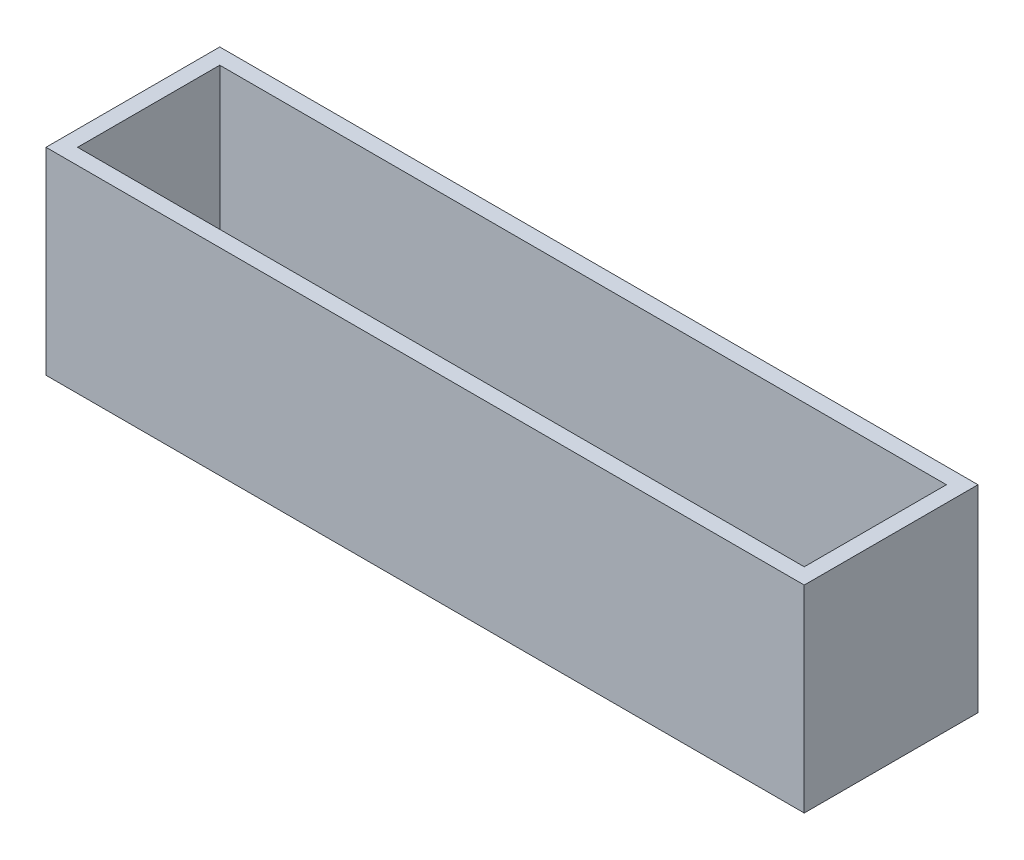
ISO-10303-21;
HEADER;
FILE_DESCRIPTION(('STEP AP214'),'2;1');
FILE_NAME('part.step','',(''),(''),'','','');
FILE_SCHEMA(('AUTOMOTIVE_DESIGN { 1 0 10303 214 1 1 1 1 }'));
ENDSEC;
DATA;
#1=APPLICATION_CONTEXT('core data for automotive mechanical design processes');
#2=APPLICATION_PROTOCOL_DEFINITION('international standard','automotive_design',2000,#1);
#3=PRODUCT_CONTEXT('',#1,'mechanical');
#4=PRODUCT('Part','Part','',(#3));
#5=PRODUCT_RELATED_PRODUCT_CATEGORY('part','',(#4));
#6=PRODUCT_DEFINITION_FORMATION('','',#4);
#7=PRODUCT_DEFINITION_CONTEXT('part definition',#1,'design');
#8=PRODUCT_DEFINITION('design','',#6,#7);
#9=PRODUCT_DEFINITION_SHAPE('','',#8);
#10=(LENGTH_UNIT() NAMED_UNIT(*) SI_UNIT(.MILLI.,.METRE.));
#11=(NAMED_UNIT(*) PLANE_ANGLE_UNIT() SI_UNIT($,.RADIAN.));
#12=(NAMED_UNIT(*) SI_UNIT($,.STERADIAN.) SOLID_ANGLE_UNIT());
#13=UNCERTAINTY_MEASURE_WITH_UNIT(LENGTH_MEASURE(1.E-05),#10,'distance_accuracy_value','');
#14=(GEOMETRIC_REPRESENTATION_CONTEXT(3) GLOBAL_UNCERTAINTY_ASSIGNED_CONTEXT((#13)) GLOBAL_UNIT_ASSIGNED_CONTEXT((#10,
#11,#12)) REPRESENTATION_CONTEXT('',''));
#15=CARTESIAN_POINT('',(0.,0.,0.));
#16=DIRECTION('',(0.,0.,1.));
#17=DIRECTION('',(1.,0.,0.));
#18=AXIS2_PLACEMENT_3D('',#15,#16,#17);
#19=CARTESIAN_POINT('',(152.4,3.175,34.925));
#20=DIRECTION('',(-1.,0.,0.));
#21=DIRECTION('',(0.,0.,1.));
#22=AXIS2_PLACEMENT_3D('',#19,#20,#21);
#23=PLANE('',#22);
#24=DIRECTION('',(0.,0.,-1.));
#25=VECTOR('',#24,1.);
#26=CARTESIAN_POINT('',(152.4,0.,34.925));
#27=LINE('',#26,#25);
#28=CARTESIAN_POINT('',(152.4,0.,34.925));
#29=VERTEX_POINT('',#28);
#30=CARTESIAN_POINT('',(152.4,0.,-34.925));
#31=VERTEX_POINT('',#30);
#32=EDGE_CURVE('E156',#29,#31,#27,.T.);
#33=ORIENTED_EDGE('',*,*,#32,.T.);
#34=DIRECTION('',(0.,-1.,0.));
#35=VECTOR('',#34,1.);
#36=CARTESIAN_POINT('',(152.4,3.175,-34.925));
#37=LINE('',#36,#35);
#38=CARTESIAN_POINT('',(152.4,79.375,-34.925));
#39=VERTEX_POINT('',#38);
#40=EDGE_CURVE('E11',#39,#31,#37,.T.);
#41=ORIENTED_EDGE('',*,*,#40,.F.);
#42=DIRECTION('',(0.,0.,-1.));
#43=VECTOR('',#42,1.);
#44=CARTESIAN_POINT('',(152.4,79.375,34.925));
#45=LINE('',#44,#43);
#46=CARTESIAN_POINT('',(152.4,79.375,34.925));
#47=VERTEX_POINT('',#46);
#48=EDGE_CURVE('E147',#47,#39,#45,.T.);
#49=ORIENTED_EDGE('',*,*,#48,.F.);
#50=DIRECTION('',(0.,-1.,0.));
#51=VECTOR('',#50,1.);
#52=CARTESIAN_POINT('',(152.4,3.175,34.925));
#53=LINE('',#52,#51);
#54=EDGE_CURVE('E164',#47,#29,#53,.T.);
#55=ORIENTED_EDGE('',*,*,#54,.T.);
#56=EDGE_LOOP('',(#33,#41,#49,#55));
#57=FACE_BOUND('',#56,.T.);
#58=ADVANCED_FACE('F39',(#57),#23,.F.);
#59=CARTESIAN_POINT('',(-152.4,3.175,-34.925));
#60=DIRECTION('',(0.,0.,1.));
#61=DIRECTION('',(1.,0.,0.));
#62=AXIS2_PLACEMENT_3D('',#59,#60,#61);
#63=PLANE('',#62);
#64=DIRECTION('',(-1.,0.,0.));
#65=VECTOR('',#64,1.);
#66=CARTESIAN_POINT('',(-152.4,0.,-34.925));
#67=LINE('',#66,#65);
#68=CARTESIAN_POINT('',(-152.4,0.,-34.925));
#69=VERTEX_POINT('',#68);
#70=EDGE_CURVE('E159',#31,#69,#67,.T.);
#71=ORIENTED_EDGE('',*,*,#70,.T.);
#72=DIRECTION('',(0.,-1.,0.));
#73=VECTOR('',#72,1.);
#74=CARTESIAN_POINT('',(-152.4,3.175,-34.925));
#75=LINE('',#74,#73);
#76=CARTESIAN_POINT('',(-152.4,79.375,-34.925));
#77=VERTEX_POINT('',#76);
#78=EDGE_CURVE('E46',#77,#69,#75,.T.);
#79=ORIENTED_EDGE('',*,*,#78,.F.);
#80=DIRECTION('',(-1.,0.,0.));
#81=VECTOR('',#80,1.);
#82=CARTESIAN_POINT('',(152.4,79.375,-34.925));
#83=LINE('',#82,#81);
#84=EDGE_CURVE('E150',#39,#77,#83,.T.);
#85=ORIENTED_EDGE('',*,*,#84,.F.);
#86=ORIENTED_EDGE('',*,*,#40,.T.);
#87=EDGE_LOOP('',(#71,#79,#85,#86));
#88=FACE_BOUND('',#87,.T.);
#89=ADVANCED_FACE('F182',(#88),#63,.F.);
#90=CARTESIAN_POINT('',(-152.4,3.175,34.925));
#91=DIRECTION('',(1.,0.,0.));
#92=DIRECTION('',(0.,0.,-1.));
#93=AXIS2_PLACEMENT_3D('',#90,#91,#92);
#94=PLANE('',#93);
#95=DIRECTION('',(0.,0.,1.));
#96=VECTOR('',#95,1.);
#97=CARTESIAN_POINT('',(-152.4,0.,34.925));
#98=LINE('',#97,#96);
#99=CARTESIAN_POINT('',(-152.4,0.,34.925));
#100=VERTEX_POINT('',#99);
#101=EDGE_CURVE('E161',#69,#100,#98,.T.);
#102=ORIENTED_EDGE('',*,*,#101,.T.);
#103=DIRECTION('',(0.,-1.,0.));
#104=VECTOR('',#103,1.);
#105=CARTESIAN_POINT('',(-152.4,3.175,34.925));
#106=LINE('',#105,#104);
#107=CARTESIAN_POINT('',(-152.4,79.375,34.925));
#108=VERTEX_POINT('',#107);
#109=EDGE_CURVE('E166',#108,#100,#106,.T.);
#110=ORIENTED_EDGE('',*,*,#109,.F.);
#111=DIRECTION('',(0.,0.,1.));
#112=VECTOR('',#111,1.);
#113=CARTESIAN_POINT('',(-152.4,79.375,-34.925));
#114=LINE('',#113,#112);
#115=EDGE_CURVE('E153',#77,#108,#114,.T.);
#116=ORIENTED_EDGE('',*,*,#115,.F.);
#117=ORIENTED_EDGE('',*,*,#78,.T.);
#118=EDGE_LOOP('',(#102,#110,#116,#117));
#119=FACE_BOUND('',#118,.T.);
#120=ADVANCED_FACE('F171',(#119),#94,.F.);
#121=CARTESIAN_POINT('',(-152.4,3.175,34.925));
#122=DIRECTION('',(0.,0.,-1.));
#123=DIRECTION('',(-1.,0.,0.));
#124=AXIS2_PLACEMENT_3D('',#121,#122,#123);
#125=PLANE('',#124);
#126=DIRECTION('',(1.,0.,0.));
#127=VECTOR('',#126,1.);
#128=CARTESIAN_POINT('',(-152.4,0.,34.925));
#129=LINE('',#128,#127);
#130=EDGE_CURVE('E61',#100,#29,#129,.T.);
#131=ORIENTED_EDGE('',*,*,#130,.T.);
#132=ORIENTED_EDGE('',*,*,#54,.F.);
#133=DIRECTION('',(1.,0.,0.));
#134=VECTOR('',#133,1.);
#135=CARTESIAN_POINT('',(-152.4,79.375,34.925));
#136=LINE('',#135,#134);
#137=EDGE_CURVE('E121',#108,#47,#136,.T.);
#138=ORIENTED_EDGE('',*,*,#137,.F.);
#139=ORIENTED_EDGE('',*,*,#109,.T.);
#140=EDGE_LOOP('',(#131,#132,#138,#139));
#141=FACE_BOUND('',#140,.T.);
#142=ADVANCED_FACE('F180',(#141),#125,.F.);
#143=CARTESIAN_POINT('',(0.,0.,0.));
#144=DIRECTION('',(0.,-1.,0.));
#145=DIRECTION('',(0.,0.,-1.));
#146=AXIS2_PLACEMENT_3D('',#143,#144,#145);
#147=PLANE('',#146);
#148=ORIENTED_EDGE('',*,*,#32,.F.);
#149=ORIENTED_EDGE('',*,*,#130,.F.);
#150=ORIENTED_EDGE('',*,*,#101,.F.);
#151=ORIENTED_EDGE('',*,*,#70,.F.);
#152=EDGE_LOOP('',(#148,#149,#150,#151));
#153=FACE_BOUND('',#152,.T.);
#154=ADVANCED_FACE('F176',(#153),#147,.T.);
#155=CARTESIAN_POINT('',(0.,79.375,0.));
#156=DIRECTION('',(0.,1.,0.));
#157=DIRECTION('',(0.,0.,1.));
#158=AXIS2_PLACEMENT_3D('',#155,#156,#157);
#159=PLANE('',#158);
#160=ORIENTED_EDGE('',*,*,#137,.T.);
#161=ORIENTED_EDGE('',*,*,#48,.T.);
#162=ORIENTED_EDGE('',*,*,#84,.T.);
#163=ORIENTED_EDGE('',*,*,#115,.T.);
#164=EDGE_LOOP('',(#160,#161,#162,#163));
#165=FACE_BOUND('',#164,.T.);
#166=DIRECTION('',(0.,0.,-1.));
#167=VECTOR('',#166,1.);
#168=CARTESIAN_POINT('',(146.05,79.375,28.575));
#169=LINE('',#168,#167);
#170=CARTESIAN_POINT('',(146.05,79.375,28.575));
#171=VERTEX_POINT('',#170);
#172=CARTESIAN_POINT('',(146.05,79.375,-28.575));
#173=VERTEX_POINT('',#172);
#174=EDGE_CURVE('E113',#171,#173,#169,.T.);
#175=ORIENTED_EDGE('',*,*,#174,.F.);
#176=DIRECTION('',(1.,0.,0.));
#177=VECTOR('',#176,1.);
#178=CARTESIAN_POINT('',(-146.05,79.375,28.575));
#179=LINE('',#178,#177);
#180=CARTESIAN_POINT('',(-146.05,79.375,28.575));
#181=VERTEX_POINT('',#180);
#182=EDGE_CURVE('E105',#181,#171,#179,.T.);
#183=ORIENTED_EDGE('',*,*,#182,.F.);
#184=DIRECTION('',(0.,0.,1.));
#185=VECTOR('',#184,1.);
#186=CARTESIAN_POINT('',(-146.05,79.375,-28.575));
#187=LINE('',#186,#185);
#188=CARTESIAN_POINT('',(-146.05,79.375,-28.575));
#189=VERTEX_POINT('',#188);
#190=EDGE_CURVE('E129',#189,#181,#187,.T.);
#191=ORIENTED_EDGE('',*,*,#190,.F.);
#192=DIRECTION('',(-1.,0.,0.));
#193=VECTOR('',#192,1.);
#194=CARTESIAN_POINT('',(146.05,79.375,-28.575));
#195=LINE('',#194,#193);
#196=EDGE_CURVE('E127',#173,#189,#195,.T.);
#197=ORIENTED_EDGE('',*,*,#196,.F.);
#198=EDGE_LOOP('',(#175,#183,#191,#197));
#199=FACE_BOUND('',#198,.T.);
#200=ADVANCED_FACE('F125',(#165,#199),#159,.T.);
#201=CARTESIAN_POINT('',(-146.05,79.375,28.575));
#202=DIRECTION('',(0.,0.,-1.));
#203=DIRECTION('',(-1.,0.,0.));
#204=AXIS2_PLACEMENT_3D('',#201,#202,#203);
#205=PLANE('',#204);
#206=DIRECTION('',(1.,0.,0.));
#207=VECTOR('',#206,1.);
#208=CARTESIAN_POINT('',(-146.05,3.175,28.575));
#209=LINE('',#208,#207);
#210=CARTESIAN_POINT('',(-146.05,3.175,28.575));
#211=VERTEX_POINT('',#210);
#212=CARTESIAN_POINT('',(146.05,3.175,28.575));
#213=VERTEX_POINT('',#212);
#214=EDGE_CURVE('E133',#211,#213,#209,.T.);
#215=ORIENTED_EDGE('',*,*,#214,.F.);
#216=DIRECTION('',(0.,-1.,0.));
#217=VECTOR('',#216,1.);
#218=CARTESIAN_POINT('',(-146.05,79.375,28.575));
#219=LINE('',#218,#217);
#220=EDGE_CURVE('E53',#181,#211,#219,.T.);
#221=ORIENTED_EDGE('',*,*,#220,.F.);
#222=ORIENTED_EDGE('',*,*,#182,.T.);
#223=DIRECTION('',(0.,-1.,0.));
#224=VECTOR('',#223,1.);
#225=CARTESIAN_POINT('',(146.05,79.375,28.575));
#226=LINE('',#225,#224);
#227=EDGE_CURVE('E108',#171,#213,#226,.T.);
#228=ORIENTED_EDGE('',*,*,#227,.T.);
#229=EDGE_LOOP('',(#215,#221,#222,#228));
#230=FACE_BOUND('',#229,.T.);
#231=ADVANCED_FACE('F107',(#230),#205,.T.);
#232=CARTESIAN_POINT('',(146.05,79.375,28.575));
#233=DIRECTION('',(-1.,0.,0.));
#234=DIRECTION('',(0.,0.,1.));
#235=AXIS2_PLACEMENT_3D('',#232,#233,#234);
#236=PLANE('',#235);
#237=DIRECTION('',(0.,0.,-1.));
#238=VECTOR('',#237,1.);
#239=CARTESIAN_POINT('',(146.05,3.175,28.575));
#240=LINE('',#239,#238);
#241=CARTESIAN_POINT('',(146.05,3.175,-28.575));
#242=VERTEX_POINT('',#241);
#243=EDGE_CURVE('E120',#213,#242,#240,.T.);
#244=ORIENTED_EDGE('',*,*,#243,.F.);
#245=ORIENTED_EDGE('',*,*,#227,.F.);
#246=ORIENTED_EDGE('',*,*,#174,.T.);
#247=DIRECTION('',(0.,-1.,0.));
#248=VECTOR('',#247,1.);
#249=CARTESIAN_POINT('',(146.05,79.375,-28.575));
#250=LINE('',#249,#248);
#251=EDGE_CURVE('E122',#173,#242,#250,.T.);
#252=ORIENTED_EDGE('',*,*,#251,.T.);
#253=EDGE_LOOP('',(#244,#245,#246,#252));
#254=FACE_BOUND('',#253,.T.);
#255=ADVANCED_FACE('F117',(#254),#236,.T.);
#256=CARTESIAN_POINT('',(146.05,79.375,-28.575));
#257=DIRECTION('',(0.,0.,1.));
#258=DIRECTION('',(1.,0.,0.));
#259=AXIS2_PLACEMENT_3D('',#256,#257,#258);
#260=PLANE('',#259);
#261=DIRECTION('',(-1.,0.,0.));
#262=VECTOR('',#261,1.);
#263=CARTESIAN_POINT('',(146.05,3.175,-28.575));
#264=LINE('',#263,#262);
#265=CARTESIAN_POINT('',(-146.05,3.175,-28.575));
#266=VERTEX_POINT('',#265);
#267=EDGE_CURVE('E136',#242,#266,#264,.T.);
#268=ORIENTED_EDGE('',*,*,#267,.F.);
#269=ORIENTED_EDGE('',*,*,#251,.F.);
#270=ORIENTED_EDGE('',*,*,#196,.T.);
#271=DIRECTION('',(0.,-1.,0.));
#272=VECTOR('',#271,1.);
#273=CARTESIAN_POINT('',(-146.05,79.375,-28.575));
#274=LINE('',#273,#272);
#275=EDGE_CURVE('E142',#189,#266,#274,.T.);
#276=ORIENTED_EDGE('',*,*,#275,.T.);
#277=EDGE_LOOP('',(#268,#269,#270,#276));
#278=FACE_BOUND('',#277,.T.);
#279=ADVANCED_FACE('F205',(#278),#260,.T.);
#280=CARTESIAN_POINT('',(-146.05,79.375,-28.575));
#281=DIRECTION('',(1.,0.,0.));
#282=DIRECTION('',(0.,0.,-1.));
#283=AXIS2_PLACEMENT_3D('',#280,#281,#282);
#284=PLANE('',#283);
#285=DIRECTION('',(0.,0.,1.));
#286=VECTOR('',#285,1.);
#287=CARTESIAN_POINT('',(-146.05,3.175,-28.575));
#288=LINE('',#287,#286);
#289=EDGE_CURVE('E114',#266,#211,#288,.T.);
#290=ORIENTED_EDGE('',*,*,#289,.F.);
#291=ORIENTED_EDGE('',*,*,#275,.F.);
#292=ORIENTED_EDGE('',*,*,#190,.T.);
#293=ORIENTED_EDGE('',*,*,#220,.T.);
#294=EDGE_LOOP('',(#290,#291,#292,#293));
#295=FACE_BOUND('',#294,.T.);
#296=ADVANCED_FACE('F197',(#295),#284,.T.);
#297=CARTESIAN_POINT('',(0.,3.175,0.));
#298=DIRECTION('',(0.,-1.,0.));
#299=DIRECTION('',(0.,0.,-1.));
#300=AXIS2_PLACEMENT_3D('',#297,#298,#299);
#301=PLANE('',#300);
#302=ORIENTED_EDGE('',*,*,#289,.T.);
#303=ORIENTED_EDGE('',*,*,#214,.T.);
#304=ORIENTED_EDGE('',*,*,#243,.T.);
#305=ORIENTED_EDGE('',*,*,#267,.T.);
#306=EDGE_LOOP('',(#302,#303,#304,#305));
#307=FACE_BOUND('',#306,.T.);
#308=ADVANCED_FACE('F194',(#307),#301,.F.);
#309=CLOSED_SHELL('',(#58,#89,#120,#142,#154,#200,#231,#255,#279,#296,#308));
#310=MANIFOLD_SOLID_BREP('B2',#309);
#311=ADVANCED_BREP_SHAPE_REPRESENTATION('',(#18,#310),#14);
#312=SHAPE_DEFINITION_REPRESENTATION(#9,#311);
ENDSEC;
END-ISO-10303-21;
